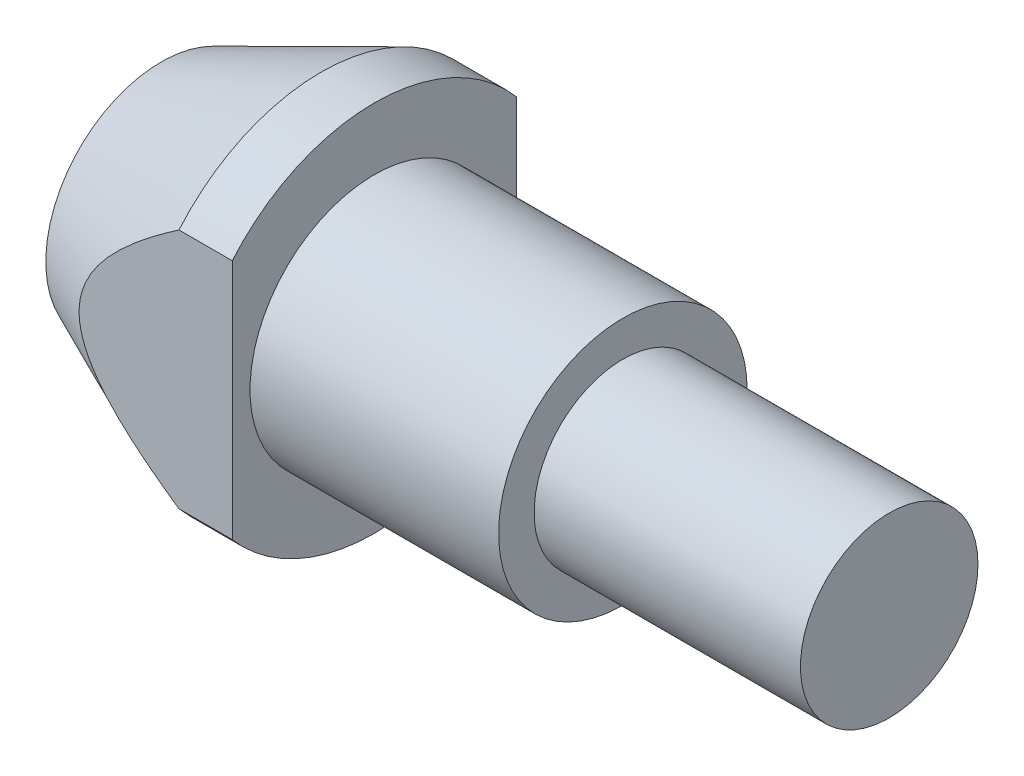
ISO-10303-21;
HEADER;
FILE_DESCRIPTION(('STEP AP214'),'2;1');
FILE_NAME('part.step','',(''),(''),'','','');
FILE_SCHEMA(('AUTOMOTIVE_DESIGN { 1 0 10303 214 1 1 1 1 }'));
ENDSEC;
DATA;
#1=APPLICATION_CONTEXT('core data for automotive mechanical design processes');
#2=APPLICATION_PROTOCOL_DEFINITION('international standard','automotive_design',2000,#1);
#3=PRODUCT_CONTEXT('',#1,'mechanical');
#4=PRODUCT('Part','Part','',(#3));
#5=PRODUCT_RELATED_PRODUCT_CATEGORY('part','',(#4));
#6=PRODUCT_DEFINITION_FORMATION('','',#4);
#7=PRODUCT_DEFINITION_CONTEXT('part definition',#1,'design');
#8=PRODUCT_DEFINITION('design','',#6,#7);
#9=PRODUCT_DEFINITION_SHAPE('','',#8);
#10=(LENGTH_UNIT() NAMED_UNIT(*) SI_UNIT(.MILLI.,.METRE.));
#11=(NAMED_UNIT(*) PLANE_ANGLE_UNIT() SI_UNIT($,.RADIAN.));
#12=(NAMED_UNIT(*) SI_UNIT($,.STERADIAN.) SOLID_ANGLE_UNIT());
#13=UNCERTAINTY_MEASURE_WITH_UNIT(LENGTH_MEASURE(1.E-05),#10,'distance_accuracy_value','');
#14=(GEOMETRIC_REPRESENTATION_CONTEXT(3) GLOBAL_UNCERTAINTY_ASSIGNED_CONTEXT((#13)) GLOBAL_UNIT_ASSIGNED_CONTEXT((#10,
#11,#12)) REPRESENTATION_CONTEXT('',''));
#15=CARTESIAN_POINT('',(0.,0.,0.));
#16=DIRECTION('',(0.,0.,1.));
#17=DIRECTION('',(1.,0.,0.));
#18=AXIS2_PLACEMENT_3D('',#15,#16,#17);
#19=CARTESIAN_POINT('',(0.,0.,0.));
#20=DIRECTION('',(1.,0.,0.));
#21=DIRECTION('',(0.,0.,-1.));
#22=AXIS2_PLACEMENT_3D('',#19,#20,#21);
#23=CYLINDRICAL_SURFACE('',#22,1.3335);
#24=DIRECTION('',(1.,0.,0.));
#25=VECTOR('',#24,1.);
#26=CARTESIAN_POINT('',(0.,0.8636933773047,1.016));
#27=LINE('',#26,#25);
#28=CARTESIAN_POINT('',(-1.778,0.8636933773047,1.016));
#29=VERTEX_POINT('',#28);
#30=CARTESIAN_POINT('',(-2.159,0.8636933773047,1.016));
#31=VERTEX_POINT('',#30);
#32=EDGE_CURVE('E64',#29,#31,#27,.F.);
#33=ORIENTED_EDGE('',*,*,#32,.F.);
#34=CARTESIAN_POINT('',(-1.778,0.,0.));
#35=DIRECTION('',(1.,0.,0.));
#36=DIRECTION('',(0.,0.,-1.));
#37=AXIS2_PLACEMENT_3D('',#34,#35,#36);
#38=CIRCLE('',#37,1.3335);
#39=CARTESIAN_POINT('',(-1.778,0.863693377304701,-1.016));
#40=VERTEX_POINT('',#39);
#41=EDGE_CURVE('E95',#40,#29,#38,.T.);
#42=ORIENTED_EDGE('',*,*,#41,.F.);
#43=DIRECTION('',(1.,0.,0.));
#44=VECTOR('',#43,1.);
#45=CARTESIAN_POINT('',(0.,0.863693377304701,-1.016));
#46=LINE('',#45,#44);
#47=CARTESIAN_POINT('',(-2.159,0.863693377304701,-1.016));
#48=VERTEX_POINT('',#47);
#49=EDGE_CURVE('E80',#48,#40,#46,.T.);
#50=ORIENTED_EDGE('',*,*,#49,.F.);
#51=CARTESIAN_POINT('',(-2.159,0.,0.));
#52=DIRECTION('',(1.,0.,0.));
#53=DIRECTION('',(0.,0.,-1.));
#54=AXIS2_PLACEMENT_3D('',#51,#52,#53);
#55=CIRCLE('',#54,1.3335);
#56=EDGE_CURVE('E100',#48,#31,#55,.T.);
#57=ORIENTED_EDGE('',*,*,#56,.T.);
#58=EDGE_LOOP('',(#33,#42,#50,#57));
#59=FACE_BOUND('',#58,.T.);
#60=ADVANCED_FACE('F36',(#59),#23,.T.);
#61=CARTESIAN_POINT('',(-1.778,1.3335,0.));
#62=DIRECTION('',(1.,0.,0.));
#63=DIRECTION('',(0.,0.,-1.));
#64=AXIS2_PLACEMENT_3D('',#61,#62,#63);
#65=PLANE('',#64);
#66=DIRECTION('',(0.,1.,0.));
#67=VECTOR('',#66,1.);
#68=CARTESIAN_POINT('',(-1.778,1.0710739689051,1.016));
#69=LINE('',#68,#67);
#70=CARTESIAN_POINT('',(-1.778,-0.8636933773047,1.016));
#71=VERTEX_POINT('',#70);
#72=EDGE_CURVE('E88',#71,#29,#69,.T.);
#73=ORIENTED_EDGE('',*,*,#72,.F.);
#74=CARTESIAN_POINT('',(-1.778,-0.8636933773047,-1.016));
#75=VERTEX_POINT('',#74);
#76=EDGE_CURVE('E97',#71,#75,#38,.T.);
#77=ORIENTED_EDGE('',*,*,#76,.T.);
#78=DIRECTION('',(0.,-1.,0.));
#79=VECTOR('',#78,1.);
#80=CARTESIAN_POINT('',(-1.778,1.0710739689051,-1.016));
#81=LINE('',#80,#79);
#82=EDGE_CURVE('E83',#40,#75,#81,.T.);
#83=ORIENTED_EDGE('',*,*,#82,.F.);
#84=ORIENTED_EDGE('',*,*,#41,.T.);
#85=EDGE_LOOP('',(#73,#77,#83,#84));
#86=FACE_BOUND('',#85,.T.);
#87=CARTESIAN_POINT('',(-1.778,0.,0.));
#88=DIRECTION('',(1.,0.,0.));
#89=DIRECTION('',(0.,0.,-1.));
#90=AXIS2_PLACEMENT_3D('',#87,#88,#89);
#91=CIRCLE('',#90,0.889);
#92=CARTESIAN_POINT('',(-1.778,0.,-0.889));
#93=VERTEX_POINT('',#92);
#94=EDGE_CURVE('E167',#93,#93,#91,.T.);
#95=ORIENTED_EDGE('',*,*,#94,.F.);
#96=EDGE_LOOP('',(#95));
#97=FACE_BOUND('',#96,.T.);
#98=ADVANCED_FACE('F38',(#86,#97),#65,.T.);
#99=DIRECTION('',(1.,0.,0.));
#100=VECTOR('',#99,1.);
#101=CARTESIAN_POINT('',(0.,-0.8636933773047,1.016));
#102=LINE('',#101,#100);
#103=CARTESIAN_POINT('',(-2.159,-0.863693377304701,1.016));
#104=VERTEX_POINT('',#103);
#105=EDGE_CURVE('E150',#104,#71,#102,.T.);
#106=ORIENTED_EDGE('',*,*,#105,.F.);
#107=CARTESIAN_POINT('',(-2.159,-0.8636933773047,-1.016));
#108=VERTEX_POINT('',#107);
#109=EDGE_CURVE('E152',#104,#108,#55,.T.);
#110=ORIENTED_EDGE('',*,*,#109,.T.);
#111=DIRECTION('',(1.,0.,0.));
#112=VECTOR('',#111,1.);
#113=CARTESIAN_POINT('',(0.,-0.8636933773047,-1.016));
#114=LINE('',#113,#112);
#115=EDGE_CURVE('E57',#75,#108,#114,.F.);
#116=ORIENTED_EDGE('',*,*,#115,.F.);
#117=ORIENTED_EDGE('',*,*,#76,.F.);
#118=EDGE_LOOP('',(#106,#110,#116,#117));
#119=FACE_BOUND('',#118,.T.);
#120=ADVANCED_FACE('F137',(#119),#23,.T.);
#121=CARTESIAN_POINT('',(-2.159,0.,0.));
#122=DIRECTION('',(1.,0.,0.));
#123=DIRECTION('',(0.,0.,-1.));
#124=AXIS2_PLACEMENT_3D('',#121,#122,#123);
#125=CONICAL_SURFACE('',#124,1.3335,0.418224329579229);
#126=CARTESIAN_POINT('',(0.402528730942126,2.25351202939341,1.016));
#127=CARTESIAN_POINT('',(0.295170243671387,2.2011635166833,1.016));
#128=CARTESIAN_POINT('',(0.187926082348021,2.14857883751109,1.016));
#129=CARTESIAN_POINT('',(-0.026377244351557,2.04273445662012,1.016));
#130=CARTESIAN_POINT('',(-0.133436070015711,1.98947406747729,1.016));
#131=CARTESIAN_POINT('',(-0.35020778727113,1.88066821337584,1.016));
#132=CARTESIAN_POINT('',(-0.459909700066225,1.8251008110223,1.016));
#133=CARTESIAN_POINT('',(-0.678658824505478,1.71298259218925,1.016));
#134=CARTESIAN_POINT('',(-0.78770661755243,1.65643290864851,1.016));
#135=CARTESIAN_POINT('',(-1.05137808020758,1.5176131799525,1.016));
#136=CARTESIAN_POINT('',(-1.20563789114728,1.43464374819769,1.016));
#137=CARTESIAN_POINT('',(-1.43551491750367,1.30674398485291,1.016));
#138=CARTESIAN_POINT('',(-1.51203917678213,1.26344688390376,1.016));
#139=CARTESIAN_POINT('',(-1.66422521592593,1.17541205385783,1.016));
#140=CARTESIAN_POINT('',(-1.73988726299673,1.13067478847783,1.016));
#141=CARTESIAN_POINT('',(-1.88858553305357,1.04013612663891,1.016));
#142=CARTESIAN_POINT('',(-1.96164424774618,0.994371963658824,1.016));
#143=CARTESIAN_POINT('',(-2.10616745912434,0.900184011030311,1.016));
#144=CARTESIAN_POINT('',(-2.1776297969048,0.851756894028655,1.016));
#145=CARTESIAN_POINT('',(-2.31742223106109,0.751466577164581,1.016));
#146=CARTESIAN_POINT('',(-2.38577073217133,0.699629765577784,1.016));
#147=CARTESIAN_POINT('',(-2.48464782801628,0.617602908309551,1.016));
#148=CARTESIAN_POINT('',(-2.51696681459024,0.589580741241172,1.016));
#149=CARTESIAN_POINT('',(-2.57990064330035,0.531694835479104,1.016));
#150=CARTESIAN_POINT('',(-2.61051669004051,0.501832430857275,1.016));
#151=CARTESIAN_POINT('',(-2.65520346739644,0.45458715264276,1.016));
#152=CARTESIAN_POINT('',(-2.6701846165965,0.438065889841447,1.016));
#153=CARTESIAN_POINT('',(-2.69930082594672,0.404274842109255,1.016));
#154=CARTESIAN_POINT('',(-2.71343546885188,0.387004695165306,1.016));
#155=CARTESIAN_POINT('',(-2.74051928229935,0.351769586848019,1.016));
#156=CARTESIAN_POINT('',(-2.75347699846212,0.333811255363545,1.016));
#157=CARTESIAN_POINT('',(-2.7780367529653,0.296994136122826,1.016));
#158=CARTESIAN_POINT('',(-2.78963920846555,0.278135627979053,1.016));
#159=CARTESIAN_POINT('',(-2.81500825051343,0.23245544052567,1.016));
#160=CARTESIAN_POINT('',(-2.82804533999662,0.205215537977653,1.016));
#161=CARTESIAN_POINT('',(-2.84974216550152,0.149045700676856,1.016));
#162=CARTESIAN_POINT('',(-2.85840958886167,0.120118834482398,1.016));
#163=CARTESIAN_POINT('',(-2.87026486538106,0.0607485078441115,1.016));
#164=CARTESIAN_POINT('',(-2.87338584804712,0.0302910329060838,1.016));
#165=CARTESIAN_POINT('',(-2.87336408607479,-0.030636700726507,1.016));
#166=CARTESIAN_POINT('',(-2.87021785372718,-0.0611069570994893,1.016));
#167=CARTESIAN_POINT('',(-2.85797185323313,-0.122180258665426,1.016));
#168=CARTESIAN_POINT('',(-2.84861481718878,-0.152729524118265,1.016));
#169=CARTESIAN_POINT('',(-2.82510846722779,-0.211901661182023,1.016));
#170=CARTESIAN_POINT('',(-2.81095072088286,-0.240521036169152,1.016));
#171=CARTESIAN_POINT('',(-2.76713833938629,-0.316873054992147,1.016));
#172=CARTESIAN_POINT('',(-2.73390424945373,-0.362517881277796,1.016));
#173=CARTESIAN_POINT('',(-2.67981712891679,-0.427319761009007,1.016));
#174=CARTESIAN_POINT('',(-2.66103035328657,-0.44835693053024,1.016));
#175=CARTESIAN_POINT('',(-2.62234933337585,-0.48938611357455,1.016));
#176=CARTESIAN_POINT('',(-2.60245560398434,-0.509378604765932,1.016));
#177=CARTESIAN_POINT('',(-2.54281635388412,-0.566787619338901,1.016));
#178=CARTESIAN_POINT('',(-2.50191873013444,-0.60299728478174,1.016));
#179=CARTESIAN_POINT('',(-2.41811320610214,-0.673028388801067,1.016));
#180=CARTESIAN_POINT('',(-2.37520385826781,-0.706848062367791,1.016));
#181=CARTESIAN_POINT('',(-2.28792326193917,-0.772750560051345,1.016));
#182=CARTESIAN_POINT('',(-2.24354884663466,-0.804829163412293,1.016));
#183=CARTESIAN_POINT('',(-2.15381519782235,-0.867583310947624,1.016));
#184=CARTESIAN_POINT('',(-2.10845580858995,-0.8982586308456,1.016));
#185=CARTESIAN_POINT('',(-1.97065116961409,-0.989067665630016,1.016));
#186=CARTESIAN_POINT('',(-1.87710547398154,-1.04752737568788,1.016));
#187=CARTESIAN_POINT('',(-1.68842062790687,-1.16144867349293,1.016));
#188=CARTESIAN_POINT('',(-1.59328402436896,-1.21691454575813,1.016));
#189=CARTESIAN_POINT('',(-1.34048616720992,-1.36075911869271,1.016));
#190=CARTESIAN_POINT('',(-1.18185700525041,-1.44743185268356,1.016));
#191=CARTESIAN_POINT('',(-0.86276306185201,-1.61756098693211,1.016));
#192=CARTESIAN_POINT('',(-0.702297075694359,-1.70101509842919,1.016));
#193=CARTESIAN_POINT('',(-0.384745853477565,-1.86345246968258,1.016));
#194=CARTESIAN_POINT('',(-0.227691115714165,-1.94249550757368,1.016));
#195=CARTESIAN_POINT('',(0.0870129714579757,-2.09901657454178,1.016));
#196=CARTESIAN_POINT('',(0.244661621802538,-2.17649600704169,1.016));
#197=CARTESIAN_POINT('',(0.402528730942126,-2.25351202939341,1.016));
#198=B_SPLINE_CURVE_WITH_KNOTS('',3,(#126,#127,#128,#129,#130,#131,#132,#133,#134,#135,#136,
#137,#138,#139,#140,#141,#142,#143,#144,#145,#146,#147,#148,#149,#150,#151,#152,#153,#154,#155,
#156,#157,#158,#159,#160,#161,#162,#163,#164,#165,#166,#167,#168,#169,#170,#171,#172,#173,#174,
#175,#176,#177,#178,#179,#180,#181,#182,#183,#184,#185,#186,#187,#188,#189,#190,#191,#192,#193,
#194,#195,#196,#197),.UNSPECIFIED.,.F.,.F.,(4,2,2,2,2,2,2,2,2,2,2,2,2,2,2,2,2,2,2,2,2,2,2,2,2,2,
2,2,2,2,2,2,2,2,2,4),(0.,0.358324465478133,0.717048558152539,1.085960928183,1.45447285483266,
1.97989004476963,2.24365004467609,2.50732594997264,2.76590992876439,3.02482469276921,
3.28192939690913,3.41020922667509,3.53839713030977,3.60528135392988,3.6721982781205,
3.73858220537716,3.80494564499367,3.89525244571237,3.98539981483255,4.07662685286632,
4.16790467298918,4.26322128668269,4.35870619843047,4.52708468110764,4.6116933464575,
4.69626298063356,4.85999152801394,5.02383975203497,5.18806890279964,5.35232421004302,
5.6831573462714,6.01350373592748,6.55571641553077,7.09830780854277,7.62576938571298,
8.152734345663),.UNSPECIFIED.);
#199=EDGE_CURVE('E11',#31,#104,#198,.T.);
#200=ORIENTED_EDGE('',*,*,#199,.F.);
#201=ORIENTED_EDGE('',*,*,#56,.F.);
#202=CARTESIAN_POINT('',(0.402528730942126,-2.25351202939341,-1.016));
#203=CARTESIAN_POINT('',(0.295170243671387,-2.2011635166833,-1.016));
#204=CARTESIAN_POINT('',(0.187926082348021,-2.14857883751109,-1.016));
#205=CARTESIAN_POINT('',(-0.0263772443515572,-2.04273445662012,-1.016));
#206=CARTESIAN_POINT('',(-0.133436070015711,-1.98947406747729,-1.016));
#207=CARTESIAN_POINT('',(-0.35020778727113,-1.88066821337584,-1.016));
#208=CARTESIAN_POINT('',(-0.459909700066225,-1.8251008110223,-1.016));
#209=CARTESIAN_POINT('',(-0.678658824505478,-1.71298259218925,-1.016));
#210=CARTESIAN_POINT('',(-0.787706617552429,-1.65643290864851,-1.016));
#211=CARTESIAN_POINT('',(-1.05137808020758,-1.5176131799525,-1.016));
#212=CARTESIAN_POINT('',(-1.20563789114727,-1.43464374819769,-1.016));
#213=CARTESIAN_POINT('',(-1.43551491750367,-1.30674398485291,-1.016));
#214=CARTESIAN_POINT('',(-1.51203917678213,-1.26344688390376,-1.016));
#215=CARTESIAN_POINT('',(-1.66422521592593,-1.17541205385783,-1.016));
#216=CARTESIAN_POINT('',(-1.73988726299672,-1.13067478847783,-1.016));
#217=CARTESIAN_POINT('',(-1.88858553305357,-1.04013612663891,-1.016));
#218=CARTESIAN_POINT('',(-1.96164424774618,-0.994371963658825,-1.016));
#219=CARTESIAN_POINT('',(-2.10616745912434,-0.900184011030311,-1.016));
#220=CARTESIAN_POINT('',(-2.1776297969048,-0.851756894028655,-1.016));
#221=CARTESIAN_POINT('',(-2.31742223106109,-0.751466577164581,-1.016));
#222=CARTESIAN_POINT('',(-2.38577073217133,-0.699629765577784,-1.016));
#223=CARTESIAN_POINT('',(-2.48464782801628,-0.617602908309551,-1.016));
#224=CARTESIAN_POINT('',(-2.51696681459024,-0.589580741241172,-1.016));
#225=CARTESIAN_POINT('',(-2.57990064330035,-0.531694835479104,-1.016));
#226=CARTESIAN_POINT('',(-2.61051669004051,-0.501832430857274,-1.016));
#227=CARTESIAN_POINT('',(-2.65520346739644,-0.45458715264276,-1.016));
#228=CARTESIAN_POINT('',(-2.6701846165965,-0.438065889841447,-1.016));
#229=CARTESIAN_POINT('',(-2.69930082594672,-0.404274842109255,-1.016));
#230=CARTESIAN_POINT('',(-2.71343546885188,-0.387004695165306,-1.016));
#231=CARTESIAN_POINT('',(-2.74051928229935,-0.35176958684802,-1.016));
#232=CARTESIAN_POINT('',(-2.75347699846212,-0.333811255363545,-1.016));
#233=CARTESIAN_POINT('',(-2.7780367529653,-0.296994136122826,-1.016));
#234=CARTESIAN_POINT('',(-2.78963920846554,-0.278135627979053,-1.016));
#235=CARTESIAN_POINT('',(-2.81500825051343,-0.23245544052567,-1.016));
#236=CARTESIAN_POINT('',(-2.82804533999662,-0.205215537977653,-1.016));
#237=CARTESIAN_POINT('',(-2.84974216550152,-0.149045700676856,-1.016));
#238=CARTESIAN_POINT('',(-2.85840958886167,-0.120118834482397,-1.016));
#239=CARTESIAN_POINT('',(-2.87026486538106,-0.0607485078441111,-1.016));
#240=CARTESIAN_POINT('',(-2.87338584804712,-0.0302910329060833,-1.016));
#241=CARTESIAN_POINT('',(-2.87336408607479,0.0306367007265076,-1.016));
#242=CARTESIAN_POINT('',(-2.87021785372718,0.06110695709949,-1.016));
#243=CARTESIAN_POINT('',(-2.85797185323313,0.122180258665426,-1.016));
#244=CARTESIAN_POINT('',(-2.84861481718878,0.152729524118265,-1.016));
#245=CARTESIAN_POINT('',(-2.82510846722779,0.211901661182024,-1.016));
#246=CARTESIAN_POINT('',(-2.81095072088286,0.240521036169152,-1.016));
#247=CARTESIAN_POINT('',(-2.76713833938629,0.316873054992149,-1.016));
#248=CARTESIAN_POINT('',(-2.73390424945373,0.362517881277798,-1.016));
#249=CARTESIAN_POINT('',(-2.67981712891679,0.427319761009009,-1.016));
#250=CARTESIAN_POINT('',(-2.66103035328656,0.448356930530242,-1.016));
#251=CARTESIAN_POINT('',(-2.62234933337585,0.489386113574551,-1.016));
#252=CARTESIAN_POINT('',(-2.60245560398433,0.509378604765934,-1.016));
#253=CARTESIAN_POINT('',(-2.54281635388412,0.566787619338902,-1.016));
#254=CARTESIAN_POINT('',(-2.50191873013444,0.602997284781741,-1.016));
#255=CARTESIAN_POINT('',(-2.41811320610214,0.673028388801069,-1.016));
#256=CARTESIAN_POINT('',(-2.37520385826781,0.706848062367793,-1.016));
#257=CARTESIAN_POINT('',(-2.28792326193917,0.772750560051347,-1.016));
#258=CARTESIAN_POINT('',(-2.24354884663466,0.804829163412295,-1.016));
#259=CARTESIAN_POINT('',(-2.15381519782234,0.867583310947627,-1.016));
#260=CARTESIAN_POINT('',(-2.10845580858995,0.898258630845603,-1.016));
#261=CARTESIAN_POINT('',(-1.97065116961408,0.989067665630019,-1.016));
#262=CARTESIAN_POINT('',(-1.87710547398153,1.04752737568788,-1.016));
#263=CARTESIAN_POINT('',(-1.68842062790687,1.16144867349293,-1.016));
#264=CARTESIAN_POINT('',(-1.59328402436895,1.21691454575813,-1.016));
#265=CARTESIAN_POINT('',(-1.34048616720991,1.36075911869271,-1.016));
#266=CARTESIAN_POINT('',(-1.18185700525041,1.44743185268357,-1.016));
#267=CARTESIAN_POINT('',(-0.862763061852006,1.61756098693211,-1.016));
#268=CARTESIAN_POINT('',(-0.702297075694355,1.70101509842919,-1.016));
#269=CARTESIAN_POINT('',(-0.384745853477563,1.86345246968258,-1.016));
#270=CARTESIAN_POINT('',(-0.227691115714163,1.94249550757368,-1.016));
#271=CARTESIAN_POINT('',(0.0870129714579768,2.09901657454178,-1.016));
#272=CARTESIAN_POINT('',(0.244661621802539,2.17649600704169,-1.016));
#273=CARTESIAN_POINT('',(0.402528730942126,2.25351202939341,-1.016));
#274=B_SPLINE_CURVE_WITH_KNOTS('',3,(#202,#203,#204,#205,#206,#207,#208,#209,#210,#211,#212,
#213,#214,#215,#216,#217,#218,#219,#220,#221,#222,#223,#224,#225,#226,#227,#228,#229,#230,#231,
#232,#233,#234,#235,#236,#237,#238,#239,#240,#241,#242,#243,#244,#245,#246,#247,#248,#249,#250,
#251,#252,#253,#254,#255,#256,#257,#258,#259,#260,#261,#262,#263,#264,#265,#266,#267,#268,#269,
#270,#271,#272,#273),.UNSPECIFIED.,.F.,.F.,(4,2,2,2,2,2,2,2,2,2,2,2,2,2,2,2,2,2,2,2,2,2,2,2,2,2,
2,2,2,2,2,2,2,2,2,4),(0.,0.358324465478133,0.717048558152539,1.085960928183,1.45447285483266,
1.97989004476963,2.24365004467609,2.50732594997264,2.76590992876439,3.02482469276921,
3.28192939690912,3.41020922667509,3.53839713030977,3.60528135392988,3.67219827812049,
3.73858220537716,3.80494564499367,3.89525244571237,3.98539981483255,4.07662685286632,
4.16790467298918,4.26322128668269,4.35870619843047,4.52708468110764,4.6116933464575,
4.69626298063356,4.85999152801394,5.02383975203497,5.18806890279964,5.35232421004303,
5.6831573462714,6.01350373592749,6.55571641553078,7.09830780854278,7.62576938571298,
8.152734345663),.UNSPECIFIED.);
#275=EDGE_CURVE('E50',#108,#48,#274,.T.);
#276=ORIENTED_EDGE('',*,*,#275,.F.);
#277=ORIENTED_EDGE('',*,*,#109,.F.);
#278=EDGE_LOOP('',(#200,#201,#276,#277));
#279=FACE_BOUND('',#278,.T.);
#280=CARTESIAN_POINT('',(-3.302,0.,0.));
#281=DIRECTION('',(1.,0.,0.));
#282=DIRECTION('',(0.,0.,-1.));
#283=AXIS2_PLACEMENT_3D('',#280,#281,#282);
#284=CIRCLE('',#283,0.8255);
#285=CARTESIAN_POINT('',(-3.302,0.,-0.8255));
#286=VERTEX_POINT('',#285);
#287=EDGE_CURVE('E155',#286,#286,#284,.T.);
#288=ORIENTED_EDGE('',*,*,#287,.T.);
#289=EDGE_LOOP('',(#288));
#290=FACE_BOUND('',#289,.T.);
#291=ADVANCED_FACE('F108',(#279,#290),#125,.T.);
#292=CARTESIAN_POINT('',(-3.302,0.,0.));
#293=DIRECTION('',(-1.,0.,0.));
#294=DIRECTION('',(0.,0.,1.));
#295=AXIS2_PLACEMENT_3D('',#292,#293,#294);
#296=PLANE('',#295);
#297=ORIENTED_EDGE('',*,*,#287,.F.);
#298=EDGE_LOOP('',(#297));
#299=FACE_BOUND('',#298,.T.);
#300=ADVANCED_FACE('F130',(#299),#296,.T.);
#301=CARTESIAN_POINT('',(1.905,0.635,0.));
#302=DIRECTION('',(1.,0.,0.));
#303=DIRECTION('',(0.,0.,-1.));
#304=AXIS2_PLACEMENT_3D('',#301,#302,#303);
#305=PLANE('',#304);
#306=CARTESIAN_POINT('',(1.905,0.,0.));
#307=DIRECTION('',(1.,0.,0.));
#308=DIRECTION('',(0.,0.,-1.));
#309=AXIS2_PLACEMENT_3D('',#306,#307,#308);
#310=CIRCLE('',#309,0.635);
#311=CARTESIAN_POINT('',(1.905,0.,-0.635));
#312=VERTEX_POINT('',#311);
#313=EDGE_CURVE('E157',#312,#312,#310,.T.);
#314=ORIENTED_EDGE('',*,*,#313,.T.);
#315=EDGE_LOOP('',(#314));
#316=FACE_BOUND('',#315,.T.);
#317=ADVANCED_FACE('F127',(#316),#305,.T.);
#318=CARTESIAN_POINT('',(0.,0.,0.));
#319=DIRECTION('',(1.,0.,0.));
#320=DIRECTION('',(0.,0.,-1.));
#321=AXIS2_PLACEMENT_3D('',#318,#319,#320);
#322=CYLINDRICAL_SURFACE('',#321,0.635);
#323=CARTESIAN_POINT('',(0.,0.,0.));
#324=DIRECTION('',(1.,0.,0.));
#325=DIRECTION('',(0.,0.,-1.));
#326=AXIS2_PLACEMENT_3D('',#323,#324,#325);
#327=CIRCLE('',#326,0.635);
#328=CARTESIAN_POINT('',(0.,0.,-0.635));
#329=VERTEX_POINT('',#328);
#330=EDGE_CURVE('E159',#329,#329,#327,.T.);
#331=ORIENTED_EDGE('',*,*,#330,.T.);
#332=EDGE_LOOP('',(#331));
#333=FACE_BOUND('',#332,.T.);
#334=ORIENTED_EDGE('',*,*,#313,.F.);
#335=EDGE_LOOP('',(#334));
#336=FACE_BOUND('',#335,.T.);
#337=ADVANCED_FACE('F123',(#333,#336),#322,.T.);
#338=CARTESIAN_POINT('',(0.,0.889,0.));
#339=DIRECTION('',(1.,0.,0.));
#340=DIRECTION('',(0.,0.,-1.));
#341=AXIS2_PLACEMENT_3D('',#338,#339,#340);
#342=PLANE('',#341);
#343=CARTESIAN_POINT('',(0.,0.,0.));
#344=DIRECTION('',(1.,0.,0.));
#345=DIRECTION('',(0.,0.,-1.));
#346=AXIS2_PLACEMENT_3D('',#343,#344,#345);
#347=CIRCLE('',#346,0.889);
#348=CARTESIAN_POINT('',(0.,0.,-0.889));
#349=VERTEX_POINT('',#348);
#350=EDGE_CURVE('E164',#349,#349,#347,.T.);
#351=ORIENTED_EDGE('',*,*,#350,.T.);
#352=EDGE_LOOP('',(#351));
#353=FACE_BOUND('',#352,.T.);
#354=ORIENTED_EDGE('',*,*,#330,.F.);
#355=EDGE_LOOP('',(#354));
#356=FACE_BOUND('',#355,.T.);
#357=ADVANCED_FACE('F119',(#353,#356),#342,.T.);
#358=CARTESIAN_POINT('',(0.,0.,0.));
#359=DIRECTION('',(1.,0.,0.));
#360=DIRECTION('',(0.,0.,-1.));
#361=AXIS2_PLACEMENT_3D('',#358,#359,#360);
#362=CYLINDRICAL_SURFACE('',#361,0.889);
#363=ORIENTED_EDGE('',*,*,#94,.T.);
#364=EDGE_LOOP('',(#363));
#365=FACE_BOUND('',#364,.T.);
#366=ORIENTED_EDGE('',*,*,#350,.F.);
#367=EDGE_LOOP('',(#366));
#368=FACE_BOUND('',#367,.T.);
#369=ADVANCED_FACE('F115',(#365,#368),#362,.T.);
#370=CARTESIAN_POINT('',(-3.302,1.0710739689051,-1.016));
#371=DIRECTION('',(0.,0.,1.));
#372=DIRECTION('',(0.,-1.,0.));
#373=AXIS2_PLACEMENT_3D('',#370,#371,#372);
#374=PLANE('',#373);
#375=ORIENTED_EDGE('',*,*,#115,.T.);
#376=ORIENTED_EDGE('',*,*,#275,.T.);
#377=ORIENTED_EDGE('',*,*,#49,.T.);
#378=ORIENTED_EDGE('',*,*,#82,.T.);
#379=EDGE_LOOP('',(#375,#376,#377,#378));
#380=FACE_BOUND('',#379,.T.);
#381=ADVANCED_FACE('F82',(#380),#374,.F.);
#382=CARTESIAN_POINT('',(-3.302,1.0710739689051,1.016));
#383=DIRECTION('',(0.,0.,-1.));
#384=DIRECTION('',(0.,1.,0.));
#385=AXIS2_PLACEMENT_3D('',#382,#383,#384);
#386=PLANE('',#385);
#387=ORIENTED_EDGE('',*,*,#32,.T.);
#388=ORIENTED_EDGE('',*,*,#199,.T.);
#389=ORIENTED_EDGE('',*,*,#105,.T.);
#390=ORIENTED_EDGE('',*,*,#72,.T.);
#391=EDGE_LOOP('',(#387,#388,#389,#390));
#392=FACE_BOUND('',#391,.T.);
#393=ADVANCED_FACE('F114',(#392),#386,.F.);
#394=CLOSED_SHELL('',(#60,#98,#120,#291,#300,#317,#337,#357,#369,#381,#393));
#395=MANIFOLD_SOLID_BREP('B2',#394);
#396=ADVANCED_BREP_SHAPE_REPRESENTATION('',(#18,#395),#14);
#397=SHAPE_DEFINITION_REPRESENTATION(#9,#396);
ENDSEC;
END-ISO-10303-21;
